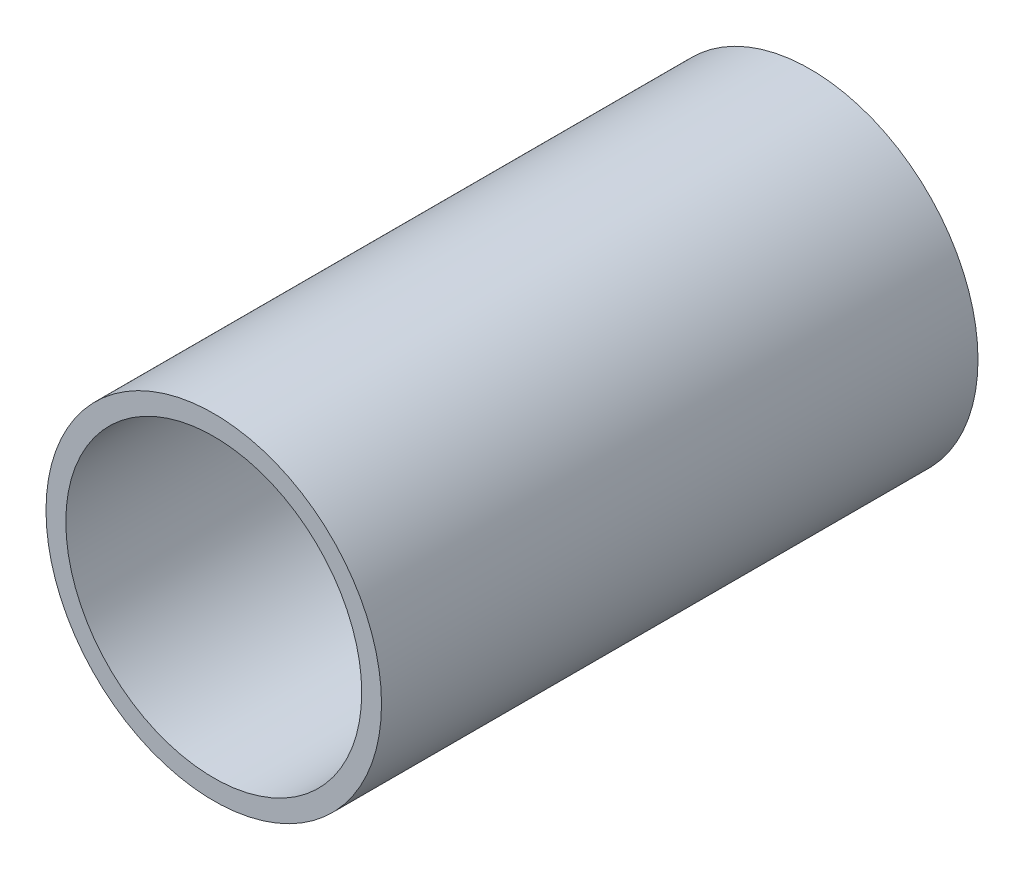
ISO-10303-21;
HEADER;
FILE_DESCRIPTION(('STEP AP214'),'2;1');
FILE_NAME('part.step','',(''),(''),'','','');
FILE_SCHEMA(('AUTOMOTIVE_DESIGN { 1 0 10303 214 1 1 1 1 }'));
ENDSEC;
DATA;
#1=APPLICATION_CONTEXT('core data for automotive mechanical design processes');
#2=APPLICATION_PROTOCOL_DEFINITION('international standard','automotive_design',2000,#1);
#3=PRODUCT_CONTEXT('',#1,'mechanical');
#4=PRODUCT('Part','Part','',(#3));
#5=PRODUCT_RELATED_PRODUCT_CATEGORY('part','',(#4));
#6=PRODUCT_DEFINITION_FORMATION('','',#4);
#7=PRODUCT_DEFINITION_CONTEXT('part definition',#1,'design');
#8=PRODUCT_DEFINITION('design','',#6,#7);
#9=PRODUCT_DEFINITION_SHAPE('','',#8);
#10=(LENGTH_UNIT() NAMED_UNIT(*) SI_UNIT(.MILLI.,.METRE.));
#11=(NAMED_UNIT(*) PLANE_ANGLE_UNIT() SI_UNIT($,.RADIAN.));
#12=(NAMED_UNIT(*) SI_UNIT($,.STERADIAN.) SOLID_ANGLE_UNIT());
#13=UNCERTAINTY_MEASURE_WITH_UNIT(LENGTH_MEASURE(1.E-05),#10,'distance_accuracy_value','');
#14=(GEOMETRIC_REPRESENTATION_CONTEXT(3) GLOBAL_UNCERTAINTY_ASSIGNED_CONTEXT((#13)) GLOBAL_UNIT_ASSIGNED_CONTEXT((#10,
#11,#12)) REPRESENTATION_CONTEXT('',''));
#15=CARTESIAN_POINT('',(0.,0.,0.));
#16=DIRECTION('',(0.,0.,1.));
#17=DIRECTION('',(1.,0.,0.));
#18=AXIS2_PLACEMENT_3D('',#15,#16,#17);
#19=CARTESIAN_POINT('',(0.,0.,0.));
#20=DIRECTION('',(0.,0.,1.));
#21=DIRECTION('',(1.,0.,0.));
#22=AXIS2_PLACEMENT_3D('',#19,#20,#21);
#23=PLANE('',#22);
#24=CARTESIAN_POINT('',(0.,0.,0.));
#25=DIRECTION('',(0.,0.,1.));
#26=DIRECTION('',(1.,0.,0.));
#27=AXIS2_PLACEMENT_3D('',#24,#25,#26);
#28=CIRCLE('',#27,28.575);
#29=CARTESIAN_POINT('',(28.575,0.,0.));
#30=VERTEX_POINT('',#29);
#31=EDGE_CURVE('E10',#30,#30,#28,.T.);
#32=ORIENTED_EDGE('',*,*,#31,.F.);
#33=EDGE_LOOP('',(#32));
#34=FACE_BOUND('',#33,.T.);
#35=CARTESIAN_POINT('',(0.,0.,0.));
#36=DIRECTION('',(0.,0.,1.));
#37=DIRECTION('',(1.,0.,0.));
#38=AXIS2_PLACEMENT_3D('',#35,#36,#37);
#39=CIRCLE('',#38,25.2);
#40=CARTESIAN_POINT('',(25.2,0.,0.));
#41=VERTEX_POINT('',#40);
#42=EDGE_CURVE('E51',#41,#41,#39,.T.);
#43=ORIENTED_EDGE('',*,*,#42,.T.);
#44=EDGE_LOOP('',(#43));
#45=FACE_BOUND('',#44,.T.);
#46=ADVANCED_FACE('F42',(#34,#45),#23,.F.);
#47=CARTESIAN_POINT('',(0.,0.,150.));
#48=DIRECTION('',(0.,0.,-1.));
#49=DIRECTION('',(-1.,0.,0.));
#50=AXIS2_PLACEMENT_3D('',#47,#48,#49);
#51=CYLINDRICAL_SURFACE('',#50,28.575);
#52=CARTESIAN_POINT('',(0.,0.,101.6));
#53=DIRECTION('',(0.,0.,-1.));
#54=DIRECTION('',(-1.,0.,0.));
#55=AXIS2_PLACEMENT_3D('',#52,#53,#54);
#56=CIRCLE('',#55,28.575);
#57=CARTESIAN_POINT('',(-28.575,0.,101.6));
#58=VERTEX_POINT('',#57);
#59=EDGE_CURVE('E56',#58,#58,#56,.T.);
#60=ORIENTED_EDGE('',*,*,#59,.T.);
#61=EDGE_LOOP('',(#60));
#62=FACE_BOUND('',#61,.T.);
#63=ORIENTED_EDGE('',*,*,#31,.T.);
#64=EDGE_LOOP('',(#63));
#65=FACE_BOUND('',#64,.T.);
#66=ADVANCED_FACE('F44',(#62,#65),#51,.T.);
#67=CARTESIAN_POINT('',(0.,0.,150.));
#68=DIRECTION('',(0.,0.,-1.));
#69=DIRECTION('',(-1.,0.,0.));
#70=AXIS2_PLACEMENT_3D('',#67,#68,#69);
#71=CYLINDRICAL_SURFACE('',#70,25.2);
#72=CARTESIAN_POINT('',(0.,0.,101.6));
#73=DIRECTION('',(0.,0.,-1.));
#74=DIRECTION('',(-1.,0.,0.));
#75=AXIS2_PLACEMENT_3D('',#72,#73,#74);
#76=CIRCLE('',#75,25.2);
#77=CARTESIAN_POINT('',(-25.2,0.,101.6));
#78=VERTEX_POINT('',#77);
#79=EDGE_CURVE('E46',#78,#78,#76,.T.);
#80=ORIENTED_EDGE('',*,*,#79,.F.);
#81=EDGE_LOOP('',(#80));
#82=FACE_BOUND('',#81,.T.);
#83=ORIENTED_EDGE('',*,*,#42,.F.);
#84=EDGE_LOOP('',(#83));
#85=FACE_BOUND('',#84,.T.);
#86=ADVANCED_FACE('F68',(#82,#85),#71,.F.);
#87=CARTESIAN_POINT('',(53.9658110182444,-28.575,101.6));
#88=DIRECTION('',(0.,0.,-1.));
#89=DIRECTION('',(-1.,0.,0.));
#90=AXIS2_PLACEMENT_3D('',#87,#88,#89);
#91=PLANE('',#90);
#92=ORIENTED_EDGE('',*,*,#79,.T.);
#93=EDGE_LOOP('',(#92));
#94=FACE_BOUND('',#93,.T.);
#95=ORIENTED_EDGE('',*,*,#59,.F.);
#96=EDGE_LOOP('',(#95));
#97=FACE_BOUND('',#96,.T.);
#98=ADVANCED_FACE('F65',(#94,#97),#91,.F.);
#99=CLOSED_SHELL('',(#46,#66,#86,#98));
#100=MANIFOLD_SOLID_BREP('B2',#99);
#101=ADVANCED_BREP_SHAPE_REPRESENTATION('',(#18,#100),#14);
#102=SHAPE_DEFINITION_REPRESENTATION(#9,#101);
ENDSEC;
END-ISO-10303-21;
